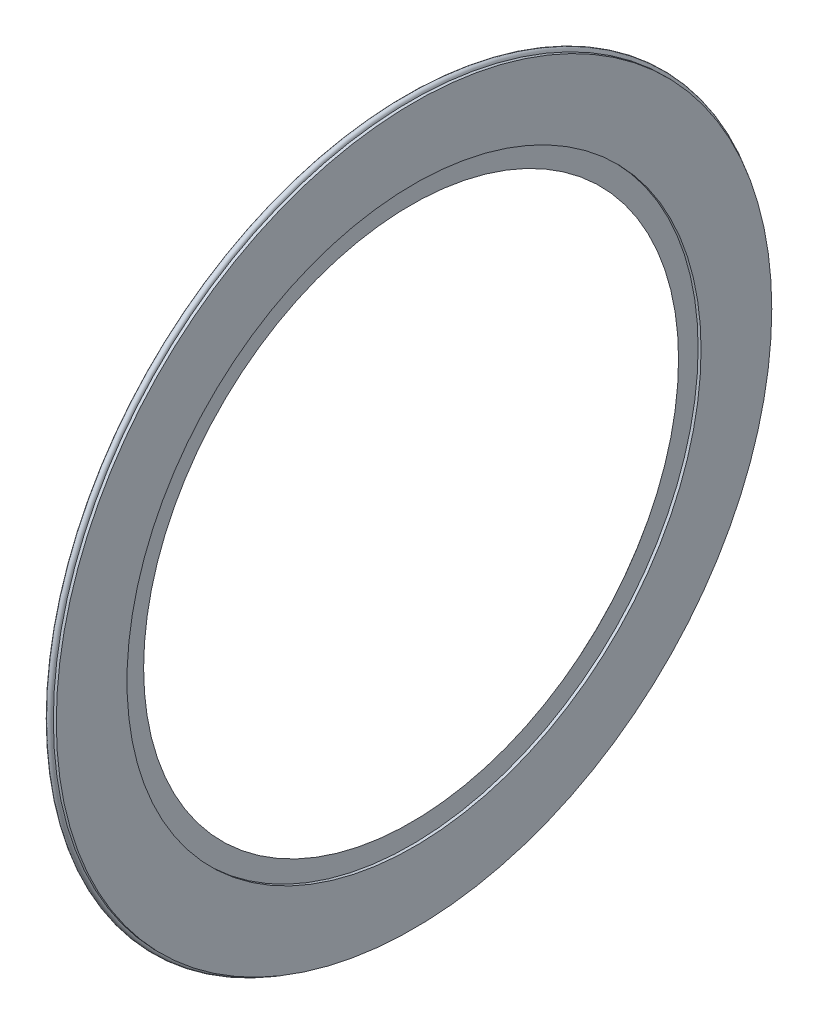
ISO-10303-21;
HEADER;
FILE_DESCRIPTION(('STEP AP214'),'2;1');
FILE_NAME('part.step','',(''),(''),'','','');
FILE_SCHEMA(('AUTOMOTIVE_DESIGN { 1 0 10303 214 1 1 1 1 }'));
ENDSEC;
DATA;
#1=APPLICATION_CONTEXT('core data for automotive mechanical design processes');
#2=APPLICATION_PROTOCOL_DEFINITION('international standard','automotive_design',2000,#1);
#3=PRODUCT_CONTEXT('',#1,'mechanical');
#4=PRODUCT('Part','Part','',(#3));
#5=PRODUCT_RELATED_PRODUCT_CATEGORY('part','',(#4));
#6=PRODUCT_DEFINITION_FORMATION('','',#4);
#7=PRODUCT_DEFINITION_CONTEXT('part definition',#1,'design');
#8=PRODUCT_DEFINITION('design','',#6,#7);
#9=PRODUCT_DEFINITION_SHAPE('','',#8);
#10=(LENGTH_UNIT() NAMED_UNIT(*) SI_UNIT(.MILLI.,.METRE.));
#11=(NAMED_UNIT(*) PLANE_ANGLE_UNIT() SI_UNIT($,.RADIAN.));
#12=(NAMED_UNIT(*) SI_UNIT($,.STERADIAN.) SOLID_ANGLE_UNIT());
#13=UNCERTAINTY_MEASURE_WITH_UNIT(LENGTH_MEASURE(1.E-05),#10,'distance_accuracy_value','');
#14=(GEOMETRIC_REPRESENTATION_CONTEXT(3) GLOBAL_UNCERTAINTY_ASSIGNED_CONTEXT((#13)) GLOBAL_UNIT_ASSIGNED_CONTEXT((#10,
#11,#12)) REPRESENTATION_CONTEXT('',''));
#15=CARTESIAN_POINT('',(0.,0.,0.));
#16=DIRECTION('',(0.,0.,1.));
#17=DIRECTION('',(1.,0.,0.));
#18=AXIS2_PLACEMENT_3D('',#15,#16,#17);
#19=CARTESIAN_POINT('',(4.75,0.,0.));
#20=DIRECTION('',(1.,0.,0.));
#21=DIRECTION('',(0.,0.,-1.));
#22=AXIS2_PLACEMENT_3D('',#19,#20,#21);
#23=TOROIDAL_SURFACE('',#22,9.4875,0.078125);
#24=CARTESIAN_POINT('',(4.828125,0.,0.));
#25=DIRECTION('',(1.,0.,0.));
#26=DIRECTION('',(0.,0.,-1.));
#27=AXIS2_PLACEMENT_3D('',#24,#25,#26);
#28=CIRCLE('',#27,9.4875);
#29=CARTESIAN_POINT('',(4.828125,0.,-9.4875));
#30=VERTEX_POINT('',#29);
#31=EDGE_CURVE('E9',#30,#30,#28,.T.);
#32=ORIENTED_EDGE('',*,*,#31,.F.);
#33=EDGE_LOOP('',(#32));
#34=FACE_BOUND('',#33,.T.);
#35=CARTESIAN_POINT('',(4.671875,0.,0.));
#36=DIRECTION('',(1.,0.,0.));
#37=DIRECTION('',(0.,0.,-1.));
#38=AXIS2_PLACEMENT_3D('',#35,#36,#37);
#39=CIRCLE('',#38,9.4875);
#40=CARTESIAN_POINT('',(4.671875,0.,-9.4875));
#41=VERTEX_POINT('',#40);
#42=EDGE_CURVE('E59',#41,#41,#39,.T.);
#43=ORIENTED_EDGE('',*,*,#42,.T.);
#44=EDGE_LOOP('',(#43));
#45=FACE_BOUND('',#44,.T.);
#46=ADVANCED_FACE('F13',(#34,#45),#23,.T.);
#47=CARTESIAN_POINT('',(4.75,0.,0.));
#48=DIRECTION('',(1.,0.,0.));
#49=DIRECTION('',(0.,0.,-1.));
#50=AXIS2_PLACEMENT_3D('',#47,#48,#49);
#51=CYLINDRICAL_SURFACE('',#50,9.4875);
#52=ORIENTED_EDGE('',*,*,#31,.T.);
#53=EDGE_LOOP('',(#52));
#54=FACE_BOUND('',#53,.T.);
#55=CARTESIAN_POINT('',(4.90625,0.,0.));
#56=DIRECTION('',(1.,0.,0.));
#57=DIRECTION('',(0.,0.,-1.));
#58=AXIS2_PLACEMENT_3D('',#55,#56,#57);
#59=CIRCLE('',#58,9.4875);
#60=CARTESIAN_POINT('',(4.90625,0.,-9.4875));
#61=VERTEX_POINT('',#60);
#62=EDGE_CURVE('E20',#61,#61,#59,.T.);
#63=ORIENTED_EDGE('',*,*,#62,.F.);
#64=EDGE_LOOP('',(#63));
#65=FACE_BOUND('',#64,.T.);
#66=ADVANCED_FACE('F78',(#54,#65),#51,.T.);
#67=CARTESIAN_POINT('',(4.90625,9.4875,0.));
#68=DIRECTION('',(-1.,0.,0.));
#69=DIRECTION('',(0.,0.,1.));
#70=AXIS2_PLACEMENT_3D('',#67,#68,#69);
#71=PLANE('',#70);
#72=CARTESIAN_POINT('',(4.90625,0.,0.));
#73=DIRECTION('',(1.,0.,0.));
#74=DIRECTION('',(0.,0.,-1.));
#75=AXIS2_PLACEMENT_3D('',#72,#73,#74);
#76=CIRCLE('',#75,7.6125);
#77=CARTESIAN_POINT('',(4.90625,0.,-7.6125));
#78=VERTEX_POINT('',#77);
#79=EDGE_CURVE('E29',#78,#78,#76,.T.);
#80=ORIENTED_EDGE('',*,*,#79,.F.);
#81=EDGE_LOOP('',(#80));
#82=FACE_BOUND('',#81,.T.);
#83=ORIENTED_EDGE('',*,*,#62,.T.);
#84=EDGE_LOOP('',(#83));
#85=FACE_BOUND('',#84,.T.);
#86=ADVANCED_FACE('F83',(#82,#85),#71,.F.);
#87=CARTESIAN_POINT('',(4.75,0.,0.));
#88=DIRECTION('',(1.,0.,0.));
#89=DIRECTION('',(0.,0.,-1.));
#90=AXIS2_PLACEMENT_3D('',#87,#88,#89);
#91=CYLINDRICAL_SURFACE('',#90,7.6125);
#92=CARTESIAN_POINT('',(4.828125,0.,0.));
#93=DIRECTION('',(1.,0.,0.));
#94=DIRECTION('',(0.,0.,-1.));
#95=AXIS2_PLACEMENT_3D('',#92,#93,#94);
#96=CIRCLE('',#95,7.6125);
#97=CARTESIAN_POINT('',(4.828125,0.,-7.6125));
#98=VERTEX_POINT('',#97);
#99=EDGE_CURVE('E37',#98,#98,#96,.T.);
#100=ORIENTED_EDGE('',*,*,#99,.F.);
#101=EDGE_LOOP('',(#100));
#102=FACE_BOUND('',#101,.T.);
#103=ORIENTED_EDGE('',*,*,#79,.T.);
#104=EDGE_LOOP('',(#103));
#105=FACE_BOUND('',#104,.T.);
#106=ADVANCED_FACE('F87',(#102,#105),#91,.F.);
#107=CARTESIAN_POINT('',(4.828125,7.6125,0.));
#108=DIRECTION('',(-1.,0.,0.));
#109=DIRECTION('',(0.,0.,1.));
#110=AXIS2_PLACEMENT_3D('',#107,#108,#109);
#111=PLANE('',#110);
#112=CARTESIAN_POINT('',(4.828125,0.,0.));
#113=DIRECTION('',(1.,0.,0.));
#114=DIRECTION('',(0.,0.,-1.));
#115=AXIS2_PLACEMENT_3D('',#112,#113,#114);
#116=CIRCLE('',#115,7.09330067882308);
#117=CARTESIAN_POINT('',(4.828125,0.,-7.09330067882308));
#118=VERTEX_POINT('',#117);
#119=EDGE_CURVE('E43',#118,#118,#116,.T.);
#120=ORIENTED_EDGE('',*,*,#119,.F.);
#121=EDGE_LOOP('',(#120));
#122=FACE_BOUND('',#121,.T.);
#123=ORIENTED_EDGE('',*,*,#99,.T.);
#124=EDGE_LOOP('',(#123));
#125=FACE_BOUND('',#124,.T.);
#126=ADVANCED_FACE('F94',(#122,#125),#111,.F.);
#127=CARTESIAN_POINT('',(5.0625,0.,0.));
#128=DIRECTION('',(1.,0.,0.));
#129=DIRECTION('',(0.,0.,-1.));
#130=AXIS2_PLACEMENT_3D('',#127,#128,#129);
#131=TOROIDAL_SURFACE('',#130,7.3,0.3125);
#132=CARTESIAN_POINT('',(4.75,0.,0.));
#133=DIRECTION('',(1.,0.,0.));
#134=DIRECTION('',(0.,0.,-1.));
#135=AXIS2_PLACEMENT_3D('',#132,#133,#134);
#136=CIRCLE('',#135,7.3);
#137=CARTESIAN_POINT('',(4.75,0.,-7.3));
#138=VERTEX_POINT('',#137);
#139=EDGE_CURVE('E47',#138,#138,#136,.T.);
#140=ORIENTED_EDGE('',*,*,#139,.F.);
#141=EDGE_LOOP('',(#140));
#142=FACE_BOUND('',#141,.T.);
#143=ORIENTED_EDGE('',*,*,#119,.T.);
#144=EDGE_LOOP('',(#143));
#145=FACE_BOUND('',#144,.T.);
#146=ADVANCED_FACE('F98',(#142,#145),#131,.T.);
#147=CARTESIAN_POINT('',(4.75,7.3,0.));
#148=DIRECTION('',(1.,0.,0.));
#149=DIRECTION('',(0.,0.,-1.));
#150=AXIS2_PLACEMENT_3D('',#147,#148,#149);
#151=PLANE('',#150);
#152=CARTESIAN_POINT('',(4.75,0.,0.));
#153=DIRECTION('',(1.,0.,0.));
#154=DIRECTION('',(0.,0.,-1.));
#155=AXIS2_PLACEMENT_3D('',#152,#153,#154);
#156=CIRCLE('',#155,9.01875);
#157=CARTESIAN_POINT('',(4.75,0.,-9.01875));
#158=VERTEX_POINT('',#157);
#159=EDGE_CURVE('E51',#158,#158,#156,.T.);
#160=ORIENTED_EDGE('',*,*,#159,.F.);
#161=EDGE_LOOP('',(#160));
#162=FACE_BOUND('',#161,.T.);
#163=ORIENTED_EDGE('',*,*,#139,.T.);
#164=EDGE_LOOP('',(#163));
#165=FACE_BOUND('',#164,.T.);
#166=ADVANCED_FACE('F74',(#162,#165),#151,.F.);
#167=CARTESIAN_POINT('',(4.75,0.,0.));
#168=DIRECTION('',(1.,0.,0.));
#169=DIRECTION('',(0.,0.,-1.));
#170=AXIS2_PLACEMENT_3D('',#167,#168,#169);
#171=CYLINDRICAL_SURFACE('',#170,9.01875);
#172=CARTESIAN_POINT('',(4.671875,0.,0.));
#173=DIRECTION('',(1.,0.,0.));
#174=DIRECTION('',(0.,0.,-1.));
#175=AXIS2_PLACEMENT_3D('',#172,#173,#174);
#176=CIRCLE('',#175,9.01875);
#177=CARTESIAN_POINT('',(4.671875,0.,-9.01875));
#178=VERTEX_POINT('',#177);
#179=EDGE_CURVE('E55',#178,#178,#176,.T.);
#180=ORIENTED_EDGE('',*,*,#179,.F.);
#181=EDGE_LOOP('',(#180));
#182=FACE_BOUND('',#181,.T.);
#183=ORIENTED_EDGE('',*,*,#159,.T.);
#184=EDGE_LOOP('',(#183));
#185=FACE_BOUND('',#184,.T.);
#186=ADVANCED_FACE('F67',(#182,#185),#171,.F.);
#187=CARTESIAN_POINT('',(4.671875,9.4875,0.));
#188=DIRECTION('',(-1.,0.,0.));
#189=DIRECTION('',(0.,0.,1.));
#190=AXIS2_PLACEMENT_3D('',#187,#188,#189);
#191=PLANE('',#190);
#192=ORIENTED_EDGE('',*,*,#179,.T.);
#193=EDGE_LOOP('',(#192));
#194=FACE_BOUND('',#193,.T.);
#195=ORIENTED_EDGE('',*,*,#42,.F.);
#196=EDGE_LOOP('',(#195));
#197=FACE_BOUND('',#196,.T.);
#198=ADVANCED_FACE('F65',(#194,#197),#191,.T.);
#199=CLOSED_SHELL('',(#46,#66,#86,#106,#126,#146,#166,#186,#198));
#200=MANIFOLD_SOLID_BREP('B1',#199);
#201=ADVANCED_BREP_SHAPE_REPRESENTATION('',(#18,#200),#14);
#202=SHAPE_DEFINITION_REPRESENTATION(#9,#201);
ENDSEC;
END-ISO-10303-21;
